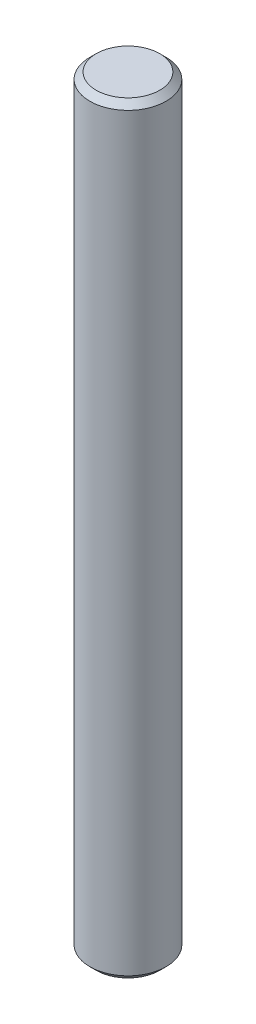
ISO-10303-21;
HEADER;
FILE_DESCRIPTION(('STEP AP214'),'2;1');
FILE_NAME('part.step','',(''),(''),'','','');
FILE_SCHEMA(('AUTOMOTIVE_DESIGN { 1 0 10303 214 1 1 1 1 }'));
ENDSEC;
DATA;
#1=APPLICATION_CONTEXT('core data for automotive mechanical design processes');
#2=APPLICATION_PROTOCOL_DEFINITION('international standard','automotive_design',2000,#1);
#3=PRODUCT_CONTEXT('',#1,'mechanical');
#4=PRODUCT('Part','Part','',(#3));
#5=PRODUCT_RELATED_PRODUCT_CATEGORY('part','',(#4));
#6=PRODUCT_DEFINITION_FORMATION('','',#4);
#7=PRODUCT_DEFINITION_CONTEXT('part definition',#1,'design');
#8=PRODUCT_DEFINITION('design','',#6,#7);
#9=PRODUCT_DEFINITION_SHAPE('','',#8);
#10=(LENGTH_UNIT() NAMED_UNIT(*) SI_UNIT(.MILLI.,.METRE.));
#11=(NAMED_UNIT(*) PLANE_ANGLE_UNIT() SI_UNIT($,.RADIAN.));
#12=(NAMED_UNIT(*) SI_UNIT($,.STERADIAN.) SOLID_ANGLE_UNIT());
#13=UNCERTAINTY_MEASURE_WITH_UNIT(LENGTH_MEASURE(1.E-05),#10,'distance_accuracy_value','');
#14=(GEOMETRIC_REPRESENTATION_CONTEXT(3) GLOBAL_UNCERTAINTY_ASSIGNED_CONTEXT((#13)) GLOBAL_UNIT_ASSIGNED_CONTEXT((#10,
#11,#12)) REPRESENTATION_CONTEXT('',''));
#15=CARTESIAN_POINT('',(0.,0.,0.));
#16=DIRECTION('',(0.,0.,1.));
#17=DIRECTION('',(1.,0.,0.));
#18=AXIS2_PLACEMENT_3D('',#15,#16,#17);
#19=CARTESIAN_POINT('',(0.,30.,0.));
#20=DIRECTION('',(0.,-1.,0.));
#21=DIRECTION('',(0.,0.,-1.));
#22=AXIS2_PLACEMENT_3D('',#19,#20,#21);
#23=CYLINDRICAL_SURFACE('',#22,1.5);
#24=CARTESIAN_POINT('',(0.,0.249999999999997,0.));
#25=DIRECTION('',(0.,1.,0.));
#26=DIRECTION('',(0.,0.,1.));
#27=AXIS2_PLACEMENT_3D('',#24,#25,#26);
#28=CIRCLE('',#27,1.5);
#29=CARTESIAN_POINT('',(0.,0.249999999999997,1.5));
#30=VERTEX_POINT('',#29);
#31=EDGE_CURVE('E53',#30,#30,#28,.T.);
#32=ORIENTED_EDGE('',*,*,#31,.T.);
#33=EDGE_LOOP('',(#32));
#34=FACE_BOUND('',#33,.T.);
#35=CARTESIAN_POINT('',(0.,29.75,0.));
#36=DIRECTION('',(0.,1.,0.));
#37=DIRECTION('',(0.,0.,1.));
#38=AXIS2_PLACEMENT_3D('',#35,#36,#37);
#39=CIRCLE('',#38,1.5);
#40=CARTESIAN_POINT('',(0.,29.75,1.5));
#41=VERTEX_POINT('',#40);
#42=EDGE_CURVE('E58',#41,#41,#39,.F.);
#43=ORIENTED_EDGE('',*,*,#42,.T.);
#44=EDGE_LOOP('',(#43));
#45=FACE_BOUND('',#44,.T.);
#46=ADVANCED_FACE('F39',(#34,#45),#23,.T.);
#47=CARTESIAN_POINT('',(0.,30.,0.));
#48=DIRECTION('',(0.,1.,0.));
#49=DIRECTION('',(0.,0.,1.));
#50=AXIS2_PLACEMENT_3D('',#47,#48,#49);
#51=PLANE('',#50);
#52=CARTESIAN_POINT('',(0.,30.,0.));
#53=DIRECTION('',(0.,1.,0.));
#54=DIRECTION('',(0.,0.,1.));
#55=AXIS2_PLACEMENT_3D('',#52,#53,#54);
#56=CIRCLE('',#55,1.25);
#57=CARTESIAN_POINT('',(0.,30.,1.25));
#58=VERTEX_POINT('',#57);
#59=EDGE_CURVE('E10',#58,#58,#56,.T.);
#60=ORIENTED_EDGE('',*,*,#59,.T.);
#61=EDGE_LOOP('',(#60));
#62=FACE_BOUND('',#61,.T.);
#63=ADVANCED_FACE('F75',(#62),#51,.T.);
#64=CARTESIAN_POINT('',(0.,0.,0.));
#65=DIRECTION('',(0.,1.,0.));
#66=DIRECTION('',(0.,0.,1.));
#67=AXIS2_PLACEMENT_3D('',#64,#65,#66);
#68=PLANE('',#67);
#69=CARTESIAN_POINT('',(0.,0.,0.));
#70=DIRECTION('',(0.,1.,0.));
#71=DIRECTION('',(0.,0.,1.));
#72=AXIS2_PLACEMENT_3D('',#69,#70,#71);
#73=CIRCLE('',#72,1.25);
#74=CARTESIAN_POINT('',(0.,0.,1.25));
#75=VERTEX_POINT('',#74);
#76=EDGE_CURVE('E48',#75,#75,#73,.F.);
#77=ORIENTED_EDGE('',*,*,#76,.T.);
#78=EDGE_LOOP('',(#77));
#79=FACE_BOUND('',#78,.T.);
#80=ADVANCED_FACE('F72',(#79),#68,.F.);
#81=CARTESIAN_POINT('',(0.,0.249999999999997,0.));
#82=DIRECTION('',(0.,1.,0.));
#83=DIRECTION('',(0.,0.,1.));
#84=AXIS2_PLACEMENT_3D('',#81,#82,#83);
#85=CONICAL_SURFACE('',#84,1.5,0.785398163397452);
#86=ORIENTED_EDGE('',*,*,#76,.F.);
#87=EDGE_LOOP('',(#86));
#88=FACE_BOUND('',#87,.T.);
#89=ORIENTED_EDGE('',*,*,#31,.F.);
#90=EDGE_LOOP('',(#89));
#91=FACE_BOUND('',#90,.T.);
#92=ADVANCED_FACE('F68',(#88,#91),#85,.T.);
#93=CARTESIAN_POINT('',(0.,30.,0.));
#94=DIRECTION('',(0.,-1.,0.));
#95=DIRECTION('',(0.,0.,-1.));
#96=AXIS2_PLACEMENT_3D('',#93,#94,#95);
#97=CONICAL_SURFACE('',#96,1.25,0.785398163397445);
#98=ORIENTED_EDGE('',*,*,#42,.F.);
#99=EDGE_LOOP('',(#98));
#100=FACE_BOUND('',#99,.T.);
#101=ORIENTED_EDGE('',*,*,#59,.F.);
#102=EDGE_LOOP('',(#101));
#103=FACE_BOUND('',#102,.T.);
#104=ADVANCED_FACE('F42',(#100,#103),#97,.T.);
#105=CLOSED_SHELL('',(#46,#63,#80,#92,#104));
#106=MANIFOLD_SOLID_BREP('B2',#105);
#107=ADVANCED_BREP_SHAPE_REPRESENTATION('',(#18,#106),#14);
#108=SHAPE_DEFINITION_REPRESENTATION(#9,#107);
ENDSEC;
END-ISO-10303-21;
